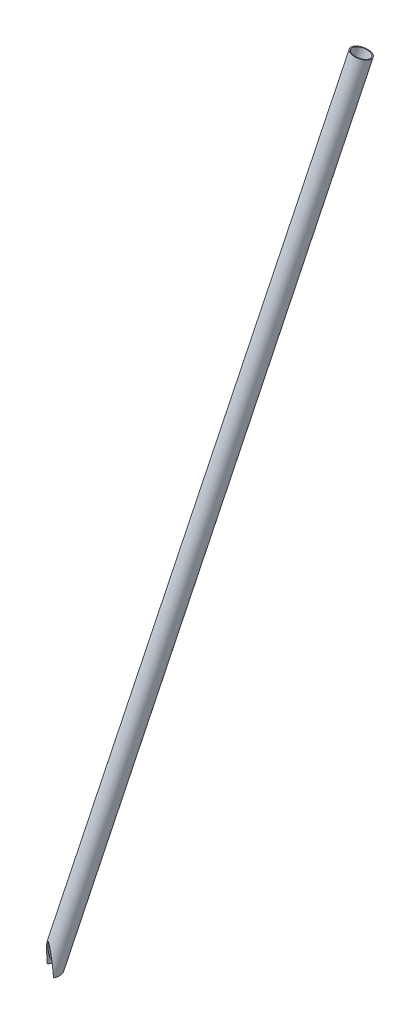
ISO-10303-21;
HEADER;
FILE_DESCRIPTION(('STEP AP214'),'2;1');
FILE_NAME('part.step','',(''),(''),'','','');
FILE_SCHEMA(('AUTOMOTIVE_DESIGN { 1 0 10303 214 1 1 1 1 }'));
ENDSEC;
DATA;
#1=APPLICATION_CONTEXT('core data for automotive mechanical design processes');
#2=APPLICATION_PROTOCOL_DEFINITION('international standard','automotive_design',2000,#1);
#3=PRODUCT_CONTEXT('',#1,'mechanical');
#4=PRODUCT('Part','Part','',(#3));
#5=PRODUCT_RELATED_PRODUCT_CATEGORY('part','',(#4));
#6=PRODUCT_DEFINITION_FORMATION('','',#4);
#7=PRODUCT_DEFINITION_CONTEXT('part definition',#1,'design');
#8=PRODUCT_DEFINITION('design','',#6,#7);
#9=PRODUCT_DEFINITION_SHAPE('','',#8);
#10=(LENGTH_UNIT() NAMED_UNIT(*) SI_UNIT(.MILLI.,.METRE.));
#11=(NAMED_UNIT(*) PLANE_ANGLE_UNIT() SI_UNIT($,.RADIAN.));
#12=(NAMED_UNIT(*) SI_UNIT($,.STERADIAN.) SOLID_ANGLE_UNIT());
#13=UNCERTAINTY_MEASURE_WITH_UNIT(LENGTH_MEASURE(1.E-05),#10,'distance_accuracy_value','');
#14=(GEOMETRIC_REPRESENTATION_CONTEXT(3) GLOBAL_UNCERTAINTY_ASSIGNED_CONTEXT((#13)) GLOBAL_UNIT_ASSIGNED_CONTEXT((#10,
#11,#12)) REPRESENTATION_CONTEXT('',''));
#15=CARTESIAN_POINT('',(0.,0.,0.));
#16=DIRECTION('',(0.,0.,1.));
#17=DIRECTION('',(1.,0.,0.));
#18=AXIS2_PLACEMENT_3D('',#15,#16,#17);
#19=CARTESIAN_POINT('',(-115.,920.,-1946.51325703663));
#20=DIRECTION('',(-0.140336447675245,-0.956366902675742,0.256257739239816));
#21=DIRECTION('',(0.,-0.258819045102517,-0.965925826289069));
#22=AXIS2_PLACEMENT_3D('',#19,#20,#21);
#23=CYLINDRICAL_SURFACE('',#22,9.79999999999998);
#24=CARTESIAN_POINT('',(-115.,920.,-1946.51325703663));
#25=DIRECTION('',(0.140336447675245,0.956366902675757,-0.25625773923976));
#26=DIRECTION('',(0.,0.258819045102461,0.965925826289084));
#27=AXIS2_PLACEMENT_3D('',#24,#25,#26);
#28=CIRCLE('',#27,9.79999999999998);
#29=CARTESIAN_POINT('',(-115.,922.536426642004,-1937.047183939));
#30=VERTEX_POINT('',#29);
#31=EDGE_CURVE('E82',#30,#30,#28,.T.);
#32=ORIENTED_EDGE('',*,*,#31,.T.);
#33=EDGE_LOOP('',(#32));
#34=FACE_BOUND('',#33,.T.);
#35=CARTESIAN_POINT('',(-249.263917886453,2.47983665031936,-1710.81017679583));
#36=CARTESIAN_POINT('',(-248.991916883071,2.46382962127187,-1710.8058863154));
#37=CARTESIAN_POINT('',(-248.719898060084,2.45024353249024,-1710.79054702353));
#38=CARTESIAN_POINT('',(-248.177762628007,2.4270322811219,-1710.73756160815));
#39=CARTESIAN_POINT('',(-247.90764698823,2.41740901110629,-1710.69990484711));
#40=CARTESIAN_POINT('',(-247.370873568324,2.40145929864528,-1710.6022009579));
#41=CARTESIAN_POINT('',(-247.104223034435,2.39513893193669,-1710.54211291258));
#42=CARTESIAN_POINT('',(-246.576850309378,2.38533535959134,-1710.39977967753));
#43=CARTESIAN_POINT('',(-246.316128058874,2.3818521255461,-1710.31753470968));
#44=CARTESIAN_POINT('',(-245.802557606436,2.3773820992804,-1710.13133917604));
#45=CARTESIAN_POINT('',(-245.549708599278,2.37639505093282,-1710.02739083835));
#46=CARTESIAN_POINT('',(-245.053719945711,2.37670214190028,-1709.7984392392));
#47=CARTESIAN_POINT('',(-244.810580602484,2.37799635239078,-1709.6734353209));
#48=CARTESIAN_POINT('',(-244.335932982965,2.38276546955804,-1709.40331785524));
#49=CARTESIAN_POINT('',(-244.104418670736,2.38623923165693,-1709.25821489391));
#50=CARTESIAN_POINT('',(-243.654562782978,2.3953779143405,-1708.9489220444));
#51=CARTESIAN_POINT('',(-243.436221011792,2.40104280237031,-1708.78473243984));
#52=CARTESIAN_POINT('',(-243.016452810283,2.41461697881692,-1708.44032905223));
#53=CARTESIAN_POINT('',(-242.814873546642,2.42250221156134,-1708.26030051237));
#54=CARTESIAN_POINT('',(-242.427461507175,2.44077810838445,-1707.88415200424));
#55=CARTESIAN_POINT('',(-242.241628677279,2.45116876385956,-1707.68803209125));
#56=CARTESIAN_POINT('',(-241.88685805506,2.47482705107068,-1707.28116973448));
#57=CARTESIAN_POINT('',(-241.717923225377,2.488095186013,-1707.07042473749));
#58=CARTESIAN_POINT('',(-241.39799570398,2.51803313569861,-1706.63596200812));
#59=CARTESIAN_POINT('',(-241.247003037975,2.53470295531608,-1706.41224425715));
#60=CARTESIAN_POINT('',(-240.962140363824,2.57238099733684,-1705.95086711769));
#61=CARTESIAN_POINT('',(-240.828491358779,2.59343769685701,-1705.71307523735));
#62=CARTESIAN_POINT('',(-240.581102405267,2.64076534342976,-1705.22783115668));
#63=CARTESIAN_POINT('',(-240.467363707953,2.66703661794195,-1704.98037835045));
#64=CARTESIAN_POINT('',(-240.260295725712,2.72613206262473,-1704.47774233834));
#65=CARTESIAN_POINT('',(-240.166972815364,2.75895827339156,-1704.22255674623));
#66=CARTESIAN_POINT('',(-240.00114777935,2.83292406127309,-1703.70670532565));
#67=CARTESIAN_POINT('',(-239.92864210214,2.87406221827733,-1703.44604044013));
#68=CARTESIAN_POINT('',(-239.815298545353,2.9589995699264,-1702.96684091494));
#69=CARTESIAN_POINT('',(-239.771156876219,3.00111917610633,-1702.7487851334));
#70=CARTESIAN_POINT('',(-239.697227458888,3.09438869113852,-1702.31217679591));
#71=CARTESIAN_POINT('',(-239.667437345132,3.14553710987585,-1702.09362432779));
#72=CARTESIAN_POINT('',(-239.622075585836,3.25889697521797,-1701.65819773101));
#73=CARTESIAN_POINT('',(-239.606485369659,3.32109384499123,-1701.44132177912));
#74=CARTESIAN_POINT('',(-239.589090289713,3.45907816876068,-1701.01136921537));
#75=CARTESIAN_POINT('',(-239.587280555614,3.53486081154969,-1700.79829128777));
#76=CARTESIAN_POINT('',(-239.595442329294,3.68025897191759,-1700.43504726076));
#77=CARTESIAN_POINT('',(-239.602392036884,3.74610205942483,-1700.28329843448));
#78=CARTESIAN_POINT('',(-239.622825466521,3.88753819189793,-1699.98488744314));
#79=CARTESIAN_POINT('',(-239.636307131652,3.96312816206965,-1699.83822369236));
#80=CARTESIAN_POINT('',(-239.669139908355,4.12472541603221,-1699.55179128155));
#81=CARTESIAN_POINT('',(-239.68847950251,4.21071206112613,-1699.41200971165));
#82=CARTESIAN_POINT('',(-239.732215593515,4.39364287976405,-1699.14062822037));
#83=CARTESIAN_POINT('',(-239.756611952258,4.49058675401958,-1699.00902807568));
#84=CARTESIAN_POINT('',(-239.809599442032,4.69576118888966,-1698.7548805838));
#85=CARTESIAN_POINT('',(-239.838208145015,4.80403845177879,-1698.63237455992));
#86=CARTESIAN_POINT('',(-239.898484178081,5.03082607332474,-1698.3980717581));
#87=CARTESIAN_POINT('',(-239.93015148512,5.14933635488615,-1698.28627489948));
#88=CARTESIAN_POINT('',(-239.995570988455,5.39552011076997,-1698.07374229163));
#89=CARTESIAN_POINT('',(-240.029325012327,5.52320163369707,-1697.97301645927));
#90=CARTESIAN_POINT('',(-240.098061661382,5.78623192267177,-1697.78256313298));
#91=CARTESIAN_POINT('',(-240.133044747369,5.92158357633817,-1697.69283982199));
#92=CARTESIAN_POINT('',(-240.220404843758,6.26445282015194,-1697.48353429161));
#93=CARTESIAN_POINT('',(-240.273128563979,6.47563090292448,-1697.37009097046));
#94=CARTESIAN_POINT('',(-240.378647612248,6.90739699649219,-1697.1628901525));
#95=CARTESIAN_POINT('',(-240.431442964592,7.12799112973004,-1697.0691457062));
#96=CARTESIAN_POINT('',(-240.536876229935,7.57646628821595,-1696.89770540727));
#97=CARTESIAN_POINT('',(-240.589512380089,7.80437551357647,-1696.82008327739));
#98=CARTESIAN_POINT('',(-240.694342614039,8.26434815680723,-1696.67845613342));
#99=CARTESIAN_POINT('',(-240.746536817138,8.4964103972596,-1696.61444732411));
#100=CARTESIAN_POINT('',(-240.842656650471,8.92737344120815,-1696.50657639271));
#101=CARTESIAN_POINT('',(-240.886617534165,9.12587619762475,-1696.4611296989));
#102=CARTESIAN_POINT('',(-240.974523453372,9.52432871964735,-1696.37703206965));
#103=CARTESIAN_POINT('',(-241.018468486816,9.72427863052048,-1696.33838182658));
#104=CARTESIAN_POINT('',(-241.150578126932,10.3258248347501,-1696.23109762044));
#105=CARTESIAN_POINT('',(-241.238975075206,10.7289260297963,-1696.17117589359));
#106=CARTESIAN_POINT('',(-241.417889911677,11.5377365935438,-1696.0688479762));
#107=CARTESIAN_POINT('',(-241.508412108945,11.9434497827473,-1696.02648133872));
#108=CARTESIAN_POINT('',(-241.692551859035,12.75526890762,-1695.95589418801));
#109=CARTESIAN_POINT('',(-241.786168576413,13.161374709012,-1695.92766988941));
#110=CARTESIAN_POINT('',(-241.977853785936,13.9744969207184,-1695.88294082624));
#111=CARTESIAN_POINT('',(-242.075935181587,14.3815122501387,-1695.86647267163));
#112=CARTESIAN_POINT('',(-242.277241504142,15.1945810537251,-1695.84387364552));
#113=CARTESIAN_POINT('',(-242.380466785343,15.6006344596131,-1695.83774348709));
#114=CARTESIAN_POINT('',(-242.592825921004,16.4106350397057,-1695.83486888411));
#115=CARTESIAN_POINT('',(-242.701951514306,16.8145843329317,-1695.83811163399));
#116=CARTESIAN_POINT('',(-242.927159373942,17.620344557602,-1695.85342021005));
#117=CARTESIAN_POINT('',(-243.043241250358,18.0221556075284,-1695.86548554212));
#118=CARTESIAN_POINT('',(-243.319799232441,18.9446261113175,-1695.90318315019));
#119=CARTESIAN_POINT('',(-243.483055443882,19.4643396349327,-1695.93182186344));
#120=CARTESIAN_POINT('',(-243.825632165768,20.4976367973706,-1696.00395162466));
#121=CARTESIAN_POINT('',(-244.004958526877,21.0112181258948,-1696.04744809825));
#122=CARTESIAN_POINT('',(-244.382101245652,22.0280847865433,-1696.15015304722));
#123=CARTESIAN_POINT('',(-244.579853021135,22.531399064694,-1696.20930788883));
#124=CARTESIAN_POINT('',(-244.89370030172,23.2771713594656,-1696.31133154431));
#125=CARTESIAN_POINT('',(-245.001167505101,23.5241903134932,-1696.34754783335));
#126=CARTESIAN_POINT('',(-245.222505521851,24.014571904495,-1696.42478173862));
#127=CARTESIAN_POINT('',(-245.336375748406,24.2579348739454,-1696.46579891522));
#128=CARTESIAN_POINT('',(-245.573701806582,24.7452287171382,-1696.55398356918));
#129=CARTESIAN_POINT('',(-245.697307161399,24.9890672756775,-1696.60126068494));
#130=CARTESIAN_POINT('',(-245.952912017097,25.4710053735143,-1696.7018775157));
#131=CARTESIAN_POINT('',(-246.084910174049,25.7091058232689,-1696.75521626113));
#132=CARTESIAN_POINT('',(-246.358602197524,26.1783475970976,-1696.86877721963));
#133=CARTESIAN_POINT('',(-246.500305555071,26.4094817812263,-1696.92900621061));
#134=CARTESIAN_POINT('',(-246.794652848393,26.8624401776439,-1697.05725128629));
#135=CARTESIAN_POINT('',(-246.947293848274,27.0842668631026,-1697.12526528424));
#136=CARTESIAN_POINT('',(-247.221419676281,27.4562885185231,-1697.25032121918));
#137=CARTESIAN_POINT('',(-247.339917946519,27.6093960406004,-1697.30523139212));
#138=CARTESIAN_POINT('',(-247.584211024716,27.9075823172108,-1697.42030387334));
#139=CARTESIAN_POINT('',(-247.710003713194,28.0526633802228,-1697.48046465853));
#140=CARTESIAN_POINT('',(-247.969415936272,28.3325599893751,-1697.60654157859));
#141=CARTESIAN_POINT('',(-248.10302141484,28.4673930249464,-1697.67244747627));
#142=CARTESIAN_POINT('',(-248.378815423154,28.724289059049,-1697.81067380473));
#143=CARTESIAN_POINT('',(-248.520998753167,28.8463596736649,-1697.88299036173));
#144=CARTESIAN_POINT('',(-248.849185417904,29.1013372849592,-1698.05257766789));
#145=CARTESIAN_POINT('',(-249.037606265755,29.2299928571767,-1698.15170790581));
#146=CARTESIAN_POINT('',(-249.427686232989,29.453998748238,-1698.36105531283));
#147=CARTESIAN_POINT('',(-249.629324861363,29.5493992353507,-1698.47125545559));
#148=CARTESIAN_POINT('',(-250.01155663173,29.6864184650327,-1698.68435107841));
#149=CARTESIAN_POINT('',(-250.190764987808,29.7339609784408,-1698.78585966029));
#150=CARTESIAN_POINT('',(-250.552096696826,29.7935173619977,-1698.99397646043));
#151=CARTESIAN_POINT('',(-250.734217653698,29.805559063583,-1699.10058061727));
#152=CARTESIAN_POINT('',(-251.096058838468,29.7926464712814,-1699.31587492047));
#153=CARTESIAN_POINT('',(-251.275777189815,29.7676647898573,-1699.4245665523));
#154=CARTESIAN_POINT('',(-251.627658616195,29.683202121144,-1699.64076205985));
#155=CARTESIAN_POINT('',(-251.799814401702,29.6236886010328,-1699.74826471797));
#156=CARTESIAN_POINT('',(-252.187877683903,29.4510323322973,-1699.99428710906));
#157=CARTESIAN_POINT('',(-252.399632691283,29.3267057346983,-1700.13142524426));
#158=CARTESIAN_POINT('',(-252.801757862808,29.0399574194363,-1700.39680896641));
#159=CARTESIAN_POINT('',(-252.992079583597,28.8774518688119,-1700.52503416779));
#160=CARTESIAN_POINT('',(-253.324817852804,28.5524606951013,-1700.75331415141));
#161=CARTESIAN_POINT('',(-253.470112322385,28.3937583606307,-1700.85468132516));
#162=CARTESIAN_POINT('',(-253.747671351766,28.0617116074696,-1701.05129778488));
#163=CARTESIAN_POINT('',(-253.879925900177,27.8883561255803,-1701.146542351));
#164=CARTESIAN_POINT('',(-254.133120805252,27.5301531482769,-1701.33167024737));
#165=CARTESIAN_POINT('',(-254.254030578738,27.3452767054347,-1701.42153886168));
#166=CARTESIAN_POINT('',(-254.485500231286,26.9670094078975,-1701.59623912482));
#167=CARTESIAN_POINT('',(-254.596062861599,26.7736208367555,-1701.68107211038));
#168=CARTESIAN_POINT('',(-254.844038573608,26.3133797228874,-1701.8743261466));
#169=CARTESIAN_POINT('',(-254.977843595092,26.0438525692371,-1701.98099136017));
#170=CARTESIAN_POINT('',(-255.231510721087,25.4957439934493,-1702.18758751445));
#171=CARTESIAN_POINT('',(-255.351366859524,25.2171587617822,-1702.287515566));
#172=CARTESIAN_POINT('',(-255.579092377173,24.6526614899255,-1702.48173160523));
#173=CARTESIAN_POINT('',(-255.686941946525,24.3667382715914,-1702.57601015678));
#174=CARTESIAN_POINT('',(-255.891853573006,23.7895484260399,-1702.75955264138));
#175=CARTESIAN_POINT('',(-255.988917186793,23.498282576973,-1702.84881729713));
#176=CARTESIAN_POINT('',(-256.17360673373,22.9108217879127,-1703.02322286435));
#177=CARTESIAN_POINT('',(-256.261211731788,22.6146175239798,-1703.10835440775));
#178=CARTESIAN_POINT('',(-256.42764140869,22.0187148206975,-1703.27488126277));
#179=CARTESIAN_POINT('',(-256.506465802451,21.7190162682461,-1703.35627645302));
#180=CARTESIAN_POINT('',(-256.655970076861,21.1170427085623,-1703.515776725));
#181=CARTESIAN_POINT('',(-256.726657302005,20.8147702934058,-1703.59388473264));
#182=CARTESIAN_POINT('',(-256.860517594756,20.2078703757617,-1703.7473614478));
#183=CARTESIAN_POINT('',(-256.923690317677,19.9032427659247,-1703.82273002956));
#184=CARTESIAN_POINT('',(-257.084133852006,19.080993372986,-1704.02242438148));
#185=CARTESIAN_POINT('',(-257.174824802064,18.5615599915976,-1704.14461546596));
#186=CARTESIAN_POINT('',(-257.337283000857,17.5186308532854,-1704.38449068802));
#187=CARTESIAN_POINT('',(-257.409046401022,16.9951342924298,-1704.50217390487));
#188=CARTESIAN_POINT('',(-257.534154111887,15.9445636422191,-1704.73536372154));
#189=CARTESIAN_POINT('',(-257.587468295989,15.4174851211268,-1704.85086647276));
#190=CARTESIAN_POINT('',(-257.675013457495,14.3619268717079,-1705.08201096285));
#191=CARTESIAN_POINT('',(-257.709250673693,13.8334476583287,-1705.19765264387));
#192=CARTESIAN_POINT('',(-257.745047783247,13.0382989252425,-1705.37428893661));
#193=CARTESIAN_POINT('',(-257.754393267803,12.7716743457734,-1705.43396438003));
#194=CARTESIAN_POINT('',(-257.767342160458,12.2386233772171,-1705.55478751322));
#195=CARTESIAN_POINT('',(-257.770945809091,11.9721969802951,-1705.61593514121));
#196=CARTESIAN_POINT('',(-257.771845687391,11.4394610956778,-1705.74045983105));
#197=CARTESIAN_POINT('',(-257.769133215746,11.17315227538,-1705.80383984988));
#198=CARTESIAN_POINT('',(-257.75658399772,10.6414300656064,-1705.93358166765));
#199=CARTESIAN_POINT('',(-257.746747566903,10.3760166369915,-1705.9999433344));
#200=CARTESIAN_POINT('',(-257.718920749906,9.84799912818303,-1706.13633608835));
#201=CARTESIAN_POINT('',(-257.700972419915,9.58538762123383,-1706.20634662209));
#202=CARTESIAN_POINT('',(-257.655433758654,9.06236550681125,-1706.35163313371));
#203=CARTESIAN_POINT('',(-257.627841202001,8.80195542152721,-1706.42691032363));
#204=CARTESIAN_POINT('',(-257.561043182911,8.28528120570896,-1706.58408253339));
#205=CARTESIAN_POINT('',(-257.521865443818,8.02900870061492,-1706.66596141896));
#206=CARTESIAN_POINT('',(-257.429143950853,7.52206329691524,-1706.83826629217));
#207=CARTESIAN_POINT('',(-257.375609780663,7.27138678317593,-1706.92868655201));
#208=CARTESIAN_POINT('',(-257.265967594978,6.83920652584979,-1707.09646551852));
#209=CARTESIAN_POINT('',(-257.213732077139,6.65585557984011,-1707.17156586667));
#210=CARTESIAN_POINT('',(-257.097227837323,6.29584417995824,-1707.3284225144));
#211=CARTESIAN_POINT('',(-257.032958042565,6.11918432424429,-1707.41017940699));
#212=CARTESIAN_POINT('',(-256.890908189576,5.77585948388874,-1707.58020925195));
#213=CARTESIAN_POINT('',(-256.813199848787,5.60914746039835,-1707.66844625233));
#214=CARTESIAN_POINT('',(-256.64250014557,5.28751429964875,-1707.85141736172));
#215=CARTESIAN_POINT('',(-256.54951515268,5.13258828748107,-1707.94614875337));
#216=CARTESIAN_POINT('',(-256.368435363999,4.86783900512617,-1708.12056041565));
#217=CARTESIAN_POINT('',(-256.283333793068,4.7553299313674,-1708.19928187894));
#218=CARTESIAN_POINT('',(-256.103071215971,4.54035770577049,-1708.35888111847));
#219=CARTESIAN_POINT('',(-256.007911542831,4.43789322615677,-1708.4397586079));
#220=CARTESIAN_POINT('',(-255.807800519339,4.24338269069679,-1708.60247903228));
#221=CARTESIAN_POINT('',(-255.702832001036,4.15135555023383,-1708.68432343236));
#222=CARTESIAN_POINT('',(-255.48401460851,3.97792683760143,-1708.84740019258));
#223=CARTESIAN_POINT('',(-255.370164196079,3.89652711249306,-1708.92863244404));
#224=CARTESIAN_POINT('',(-255.108904286785,3.72730101106077,-1709.10655113633));
#225=CARTESIAN_POINT('',(-254.959580219941,3.64192518373977,-1709.20275769588));
#226=CARTESIAN_POINT('',(-254.650938741036,3.48476960505312,-1709.39007735671));
#227=CARTESIAN_POINT('',(-254.491618740475,3.41299339488558,-1709.48118912702));
#228=CARTESIAN_POINT('',(-254.164251883555,3.28110195095204,-1709.65684352252));
#229=CARTESIAN_POINT('',(-253.996185790606,3.22101392856404,-1709.74137055002));
#230=CARTESIAN_POINT('',(-253.653035271623,3.11090156157967,-1709.90238716662));
#231=CARTESIAN_POINT('',(-253.47794885571,3.06088009483139,-1709.97887445433));
#232=CARTESIAN_POINT('',(-253.062522238022,2.95398305288265,-1710.14689876826));
#233=CARTESIAN_POINT('',(-252.819912347618,2.90039487328698,-1710.23493457737));
#234=CARTESIAN_POINT('',(-252.326709901761,2.80500974139915,-1710.39340836069));
#235=CARTESIAN_POINT('',(-252.07611425721,2.76321741521116,-1710.46383942943));
#236=CARTESIAN_POINT('',(-251.569527691094,2.6890087515395,-1710.58584030366));
#237=CARTESIAN_POINT('',(-251.313547531888,2.65657532324467,-1710.63744453606));
#238=CARTESIAN_POINT('',(-250.797726546955,2.59908032908544,-1710.72113474204));
#239=CARTESIAN_POINT('',(-250.537887813134,2.57401491170483,-1710.75323092258));
#240=CARTESIAN_POINT('',(-250.108729101397,2.53763890116544,-1710.78952380625));
#241=CARTESIAN_POINT('',(-249.940026675873,2.52460445271867,-1710.79958020358));
#242=CARTESIAN_POINT('',(-249.60219107196,2.50068027619771,-1710.81124039126));
#243=CARTESIAN_POINT('',(-249.43305792445,2.48979039853226,-1710.81284477137));
#244=CARTESIAN_POINT('',(-249.263917886453,2.47983665031936,-1710.81017679583));
#245=B_SPLINE_CURVE_WITH_KNOTS('',3,(#35,#36,#37,#38,#39,#40,#41,#42,#43,#44,#45,#46,#47,#48,
#49,#50,#51,#52,#53,#54,#55,#56,#57,#58,#59,#60,#61,#62,#63,#64,#65,#66,#67,#68,#69,#70,#71,#72,
#73,#74,#75,#76,#77,#78,#79,#80,#81,#82,#83,#84,#85,#86,#87,#88,#89,#90,#91,#92,#93,#94,#95,#96,
#97,#98,#99,#100,#101,#102,#103,#104,#105,#106,#107,#108,#109,#110,#111,#112,#113,#114,#115,
#116,#117,#118,#119,#120,#121,#122,#123,#124,#125,#126,#127,#128,#129,#130,#131,#132,#133,#134,
#135,#136,#137,#138,#139,#140,#141,#142,#143,#144,#145,#146,#147,#148,#149,#150,#151,#152,#153,
#154,#155,#156,#157,#158,#159,#160,#161,#162,#163,#164,#165,#166,#167,#168,#169,#170,#171,#172,
#173,#174,#175,#176,#177,#178,#179,#180,#181,#182,#183,#184,#185,#186,#187,#188,#189,#190,#191,
#192,#193,#194,#195,#196,#197,#198,#199,#200,#201,#202,#203,#204,#205,#206,#207,#208,#209,#210,
#211,#212,#213,#214,#215,#216,#217,#218,#219,#220,#221,#222,#223,#224,#225,#226,#227,#228,#229,
#230,#231,#232,#233,#234,#235,#236,#237,#238,#239,#240,#241,#242,#243,#244),.UNSPECIFIED.,.T.,
.F.,(4,2,2,2,2,2,2,2,2,2,2,2,2,2,2,2,2,2,2,2,2,2,2,2,2,2,2,2,2,2,2,2,2,2,2,2,2,2,2,2,2,2,2,2,2,
2,2,2,2,2,2,2,2,2,2,2,2,2,2,2,2,2,2,2,2,2,2,2,2,2,2,2,2,2,2,2,2,2,2,2,2,2,2,2,2,2,2,2,2,2,2,2,2,
2,2,2,2,2,2,2,2,2,2,2,4),(0.,0.817365367005466,1.63512064157883,2.45437493980025,
3.27362103464883,4.09278306537658,4.91197065447728,5.73072841199092,6.54947400519642,
7.35966957411855,8.16986236088294,8.98019694651793,9.79053269326667,10.6103493140493,
11.4302174331458,12.2503411817869,13.0703249291648,13.7490346677799,14.4276324967134,
15.1053415752631,15.782811125238,16.2790691129542,16.7751709302234,17.2703036120749,
17.7654227730166,18.2626691472212,18.759911775505,19.2575962407304,19.7554693332305,
20.490532319727,21.2260807600878,21.9649219990448,22.7035569878362,23.328416740591,
23.9533401123872,25.2037901245911,26.4570423826598,27.7099590130993,28.9667605462937,
30.2236487645104,31.4788205945206,32.7339221345922,34.3699941686063,36.0066642866761,
37.6377993613753,38.4531071430393,39.2683403260001,40.1004310094298,40.9323887852456,
41.7651721079725,42.5977327254129,43.2011653506824,43.8044235115257,44.4066278816378,
45.0084708048383,45.7524767964319,46.4953554809887,47.1267131553841,47.757575734911,
48.3889052193298,49.0208304541083,49.859861204059,50.7007517981565,51.4132868430794,
52.1263647447131,52.8413128195543,53.5560702501826,54.5131957329656,55.4707290948033,
56.4298195995526,57.3887715055188,58.3498041680823,59.3108680238592,60.2710575203778,
61.231291043281,62.8546462674103,64.4783313170951,66.104655384119,67.7304472773563,
68.5505395349552,69.370597436797,70.1917857480757,71.0129376862211,71.8298803445426,
72.6470116351256,73.4622031396558,74.2768518092797,74.8911065463608,75.5054160665116,
76.1165430401507,76.7274158505117,77.2114536234063,77.6954273257542,78.1802645631214,
78.6651859540852,79.2555380826555,79.8460437221231,80.4379080877311,81.0299414171518,
81.8196352431879,82.6096383428084,83.3981895085095,84.1863277349934,84.6946304800887,
85.2028977567318),.UNSPECIFIED.);
#246=CARTESIAN_POINT('',(-249.263917886453,2.47983665031936,-1710.81017679583));
#247=VERTEX_POINT('',#246);
#248=EDGE_CURVE('E46',#247,#247,#245,.T.);
#249=ORIENTED_EDGE('',*,*,#248,.T.);
#250=EDGE_LOOP('',(#249));
#251=FACE_BOUND('',#250,.T.);
#252=ADVANCED_FACE('F41',(#34,#251),#23,.F.);
#253=CARTESIAN_POINT('',(-115.,920.,-1946.51325703663));
#254=DIRECTION('',(-0.140336447675245,-0.956366902675742,0.256257739239816));
#255=DIRECTION('',(0.,-0.258819045102517,-0.965925826289069));
#256=AXIS2_PLACEMENT_3D('',#253,#254,#255);
#257=CYLINDRICAL_SURFACE('',#256,11.);
#258=CARTESIAN_POINT('',(-115.,920.,-1946.51325703663));
#259=DIRECTION('',(0.140336447675245,0.956366902675757,-0.25625773923976));
#260=DIRECTION('',(0.,0.258819045102461,0.965925826289084));
#261=AXIS2_PLACEMENT_3D('',#258,#259,#260);
#262=CIRCLE('',#261,11.);
#263=CARTESIAN_POINT('',(-115.,922.847009496127,-1935.88807294745));
#264=VERTEX_POINT('',#263);
#265=EDGE_CURVE('E63',#264,#264,#262,.T.);
#266=ORIENTED_EDGE('',*,*,#265,.F.);
#267=EDGE_LOOP('',(#266));
#268=FACE_BOUND('',#267,.T.);
#269=CARTESIAN_POINT('',(-250.,0.,-1700.));
#270=DIRECTION('',(-0.508456010272344,-0.0599232902931692,0.859000398660194));
#271=DIRECTION('',(0.0394871934442316,-0.998148808069163,-0.0462570913915509));
#272=AXIS2_PLACEMENT_3D('',#269,#270,#271);
#273=ELLIPSE('',#272,31.5376862377806,11.);
#274=CARTESIAN_POINT('',(-240.537996887139,0.114398006523072,-1694.39130940519));
#275=VERTEX_POINT('',#274);
#276=CARTESIAN_POINT('',(-259.462003112861,-0.114398006522879,-1705.60869059481));
#277=VERTEX_POINT('',#276);
#278=EDGE_CURVE('E56',#275,#277,#273,.T.);
#279=ORIENTED_EDGE('',*,*,#278,.F.);
#280=CARTESIAN_POINT('',(-250.,0.,-1700.));
#281=DIRECTION('',(0.0394871934442316,-0.998148808069163,-0.0462570913915509));
#282=DIRECTION('',(-0.508456010272344,-0.0599232902931692,0.859000398660194));
#283=AXIS2_PLACEMENT_3D('',#280,#281,#282);
#284=ELLIPSE('',#283,11.7370734990693,11.);
#285=EDGE_CURVE('E11',#277,#275,#284,.T.);
#286=ORIENTED_EDGE('',*,*,#285,.F.);
#287=EDGE_LOOP('',(#279,#286));
#288=FACE_BOUND('',#287,.T.);
#289=ADVANCED_FACE('F65',(#268,#288),#257,.T.);
#290=CARTESIAN_POINT('',(-115.,920.,-1946.51325703663));
#291=DIRECTION('',(0.140336447675245,0.956366902675757,-0.25625773923976));
#292=DIRECTION('',(0.,0.258819045102461,0.965925826289084));
#293=AXIS2_PLACEMENT_3D('',#290,#291,#292);
#294=PLANE('',#293);
#295=ORIENTED_EDGE('',*,*,#31,.F.);
#296=EDGE_LOOP('',(#295));
#297=FACE_BOUND('',#296,.T.);
#298=ORIENTED_EDGE('',*,*,#265,.T.);
#299=EDGE_LOOP('',(#298));
#300=FACE_BOUND('',#299,.T.);
#301=ADVANCED_FACE('F67',(#297,#300),#294,.T.);
#302=CARTESIAN_POINT('',(-250.,0.,-1700.));
#303=DIRECTION('',(-0.214351342090107,0.914565726251124,0.342962147344171));
#304=DIRECTION('',(0.,-0.351123441588391,0.936329177569045));
#305=AXIS2_PLACEMENT_3D('',#302,#303,#304);
#306=CYLINDRICAL_SURFACE('',#305,11.);
#307=ORIENTED_EDGE('',*,*,#248,.F.);
#308=EDGE_LOOP('',(#307));
#309=FACE_BOUND('',#308,.T.);
#310=ORIENTED_EDGE('',*,*,#278,.T.);
#311=ORIENTED_EDGE('',*,*,#285,.T.);
#312=EDGE_LOOP('',(#310,#311));
#313=FACE_BOUND('',#312,.T.);
#314=ADVANCED_FACE('F43',(#309,#313),#306,.F.);
#315=CLOSED_SHELL('',(#252,#289,#301,#314));
#316=MANIFOLD_SOLID_BREP('B2',#315);
#317=ADVANCED_BREP_SHAPE_REPRESENTATION('',(#18,#316),#14);
#318=SHAPE_DEFINITION_REPRESENTATION(#9,#317);
ENDSEC;
END-ISO-10303-21;
